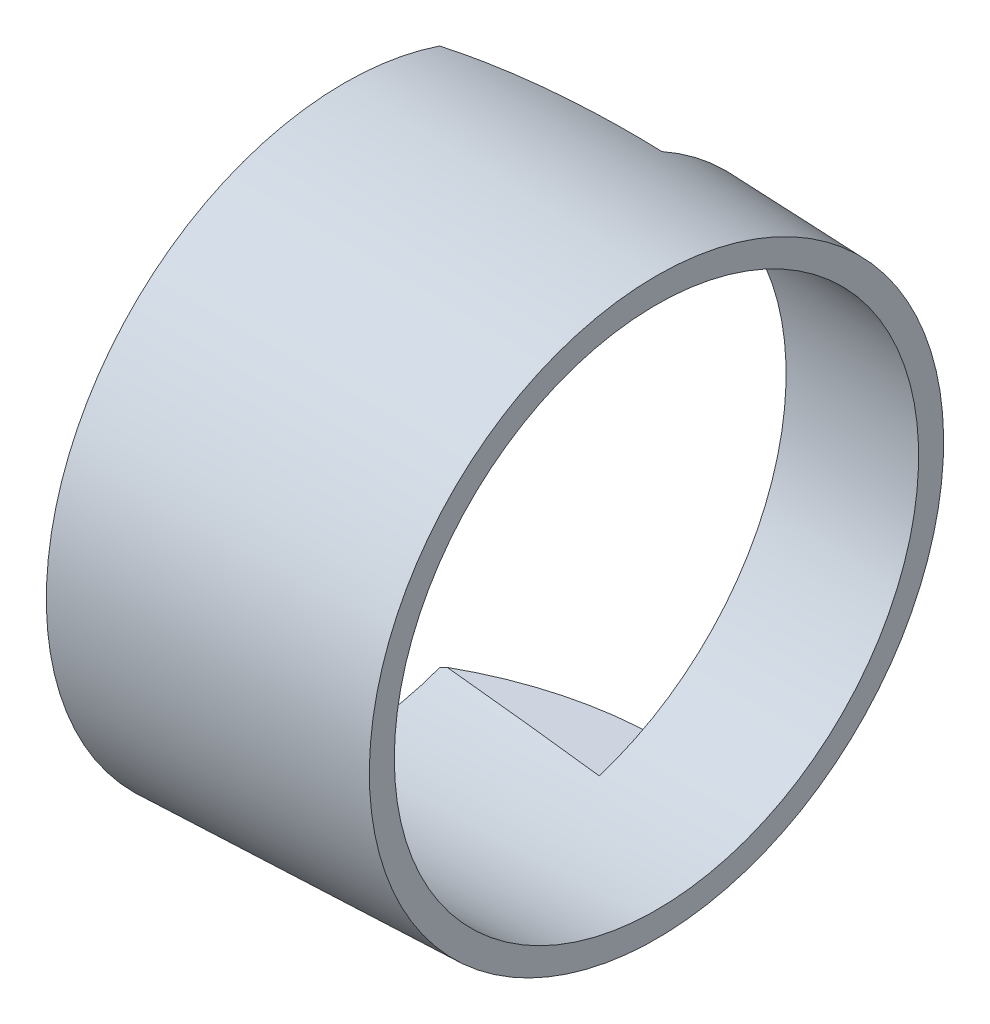
ISO-10303-21;
HEADER;
FILE_DESCRIPTION(('STEP AP214'),'2;1');
FILE_NAME('part.step','',(''),(''),'','','');
FILE_SCHEMA(('AUTOMOTIVE_DESIGN { 1 0 10303 214 1 1 1 1 }'));
ENDSEC;
DATA;
#1=APPLICATION_CONTEXT('core data for automotive mechanical design processes');
#2=APPLICATION_PROTOCOL_DEFINITION('international standard','automotive_design',2000,#1);
#3=PRODUCT_CONTEXT('',#1,'mechanical');
#4=PRODUCT('Part','Part','',(#3));
#5=PRODUCT_RELATED_PRODUCT_CATEGORY('part','',(#4));
#6=PRODUCT_DEFINITION_FORMATION('','',#4);
#7=PRODUCT_DEFINITION_CONTEXT('part definition',#1,'design');
#8=PRODUCT_DEFINITION('design','',#6,#7);
#9=PRODUCT_DEFINITION_SHAPE('','',#8);
#10=(LENGTH_UNIT() NAMED_UNIT(*) SI_UNIT(.MILLI.,.METRE.));
#11=(NAMED_UNIT(*) PLANE_ANGLE_UNIT() SI_UNIT($,.RADIAN.));
#12=(NAMED_UNIT(*) SI_UNIT($,.STERADIAN.) SOLID_ANGLE_UNIT());
#13=UNCERTAINTY_MEASURE_WITH_UNIT(LENGTH_MEASURE(1.E-05),#10,'distance_accuracy_value','');
#14=(GEOMETRIC_REPRESENTATION_CONTEXT(3) GLOBAL_UNCERTAINTY_ASSIGNED_CONTEXT((#13)) GLOBAL_UNIT_ASSIGNED_CONTEXT((#10,
#11,#12)) REPRESENTATION_CONTEXT('',''));
#15=CARTESIAN_POINT('',(0.,0.,0.));
#16=DIRECTION('',(0.,0.,1.));
#17=DIRECTION('',(1.,0.,0.));
#18=AXIS2_PLACEMENT_3D('',#15,#16,#17);
#19=CARTESIAN_POINT('',(-25.,40.65,762.767890449208));
#20=DIRECTION('',(0.,1.,0.));
#21=DIRECTION('',(0.,0.,1.));
#22=AXIS2_PLACEMENT_3D('',#19,#20,#21);
#23=PLANE('',#22);
#24=CARTESIAN_POINT('',(-59.4047124183592,40.65,-0.782885718199415));
#25=CARTESIAN_POINT('',(-57.6717544566597,40.65,-0.653370798799886));
#26=CARTESIAN_POINT('',(-55.9389285981839,40.65,-0.522071836660222));
#27=CARTESIAN_POINT('',(-52.4735860389012,40.65,-0.255413979712227));
#28=CARTESIAN_POINT('',(-50.7410693387126,40.65,-0.120055076874431));
#29=CARTESIAN_POINT('',(-47.2762805738647,40.65,0.155223242577607));
#30=CARTESIAN_POINT('',(-45.5440085334455,40.65,0.295142964826463));
#31=CARTESIAN_POINT('',(-42.0798898436248,40.65,0.58015982339515));
#32=CARTESIAN_POINT('',(-40.3480431942092,40.65,0.725256959544753));
#33=CARTESIAN_POINT('',(-36.8780005518514,40.65,1.02198178604998));
#34=CARTESIAN_POINT('',(-35.1398065715517,40.65,1.17363306052303));
#35=CARTESIAN_POINT('',(-31.664041477714,40.65,1.48390863033523));
#36=CARTESIAN_POINT('',(-29.9264703635171,40.65,1.64253291827625));
#37=CARTESIAN_POINT('',(-26.4521336354311,40.65,1.96801965172869));
#38=CARTESIAN_POINT('',(-24.7153680056737,40.65,2.13488192732839));
#39=CARTESIAN_POINT('',(-21.2428228127734,40.65,2.47853619626773));
#40=CARTESIAN_POINT('',(-19.5070432458318,40.65,2.65532815108969));
#41=CARTESIAN_POINT('',(-16.0386609915337,40.65,3.02096474659446));
#42=CARTESIAN_POINT('',(-14.3060569042739,40.65,3.20979602722264));
#43=CARTESIAN_POINT('',(-10.8426354286919,40.65,3.60304970967851));
#44=CARTESIAN_POINT('',(-9.11181801628107,40.65,3.80747189844636));
#45=CARTESIAN_POINT('',(-5.6553013417985,40.65,4.23665195671833));
#46=CARTESIAN_POINT('',(-3.92959829690848,40.65,4.46137884396294));
#47=CARTESIAN_POINT('',(-1.34404632673419,40.65,4.82054719596039));
#48=CARTESIAN_POINT('',(-0.482666034986479,40.65,4.94395435145949));
#49=CARTESIAN_POINT('',(1.23873137293134,40.65,5.19993602215274));
#50=CARTESIAN_POINT('',(2.09874850419078,40.65,5.33251043513589));
#51=CARTESIAN_POINT('',(3.81810210149362,40.65,5.6095355874917));
#52=CARTESIAN_POINT('',(4.67743596257159,40.65,5.75400256832404));
#53=CARTESIAN_POINT('',(6.39318087877449,40.65,6.05847517921849));
#54=CARTESIAN_POINT('',(7.24959259479038,40.65,6.21847701618393));
#55=CARTESIAN_POINT('',(8.53143188239395,40.65,6.47537608280779));
#56=CARTESIAN_POINT('',(8.95853611997325,40.65,6.56389066037175));
#57=CARTESIAN_POINT('',(9.81119439235369,40.65,6.74794585071401));
#58=CARTESIAN_POINT('',(10.2367485674991,40.65,6.84348580993052));
#59=CARTESIAN_POINT('',(11.0860819121103,40.65,7.04363981274982));
#60=CARTESIAN_POINT('',(11.5098595126879,40.65,7.14826060173352));
#61=CARTESIAN_POINT('',(12.1431993565133,40.65,7.3143481122903));
#62=CARTESIAN_POINT('',(12.3539575551725,40.65,7.37124625526349));
#63=CARTESIAN_POINT('',(12.7744586054105,40.65,7.48874324435476));
#64=CARTESIAN_POINT('',(12.9842013620448,40.65,7.54934242957599));
#65=CARTESIAN_POINT('',(13.1933083356044,40.65,7.61211322867195));
#66=B_SPLINE_CURVE_WITH_KNOTS('',3,(#24,#25,#26,#27,#28,#29,#30,#31,#32,#33,#34,#35,#36,#37,#38,
#39,#40,#41,#42,#43,#44,#45,#46,#47,#48,#49,#50,#51,#52,#53,#54,#55,#56,#57,#58,#59,#60,#61,#62,
#63,#64,#65),.UNSPECIFIED.,.F.,.F.,(4,2,2,2,2,2,2,2,2,2,2,2,2,2,2,2,2,2,2,2,4),(0.,
5.21337376950524,10.4267578503364,15.6404920173271,20.8542260128951,26.0886049205283,
31.3229782747923,36.5572437131295,41.791488848916,47.0200233633911,52.248486439359,
57.4691021315032,60.079592549043,62.6900538654205,65.3041413441511,67.9175921469116,
69.2260862436314,70.5344587665334,71.8438116251954,72.4986922854007,73.1536330384668),.UNSPECIFIED.);
#67=CARTESIAN_POINT('',(-11.,40.65,3.58743809523987));
#68=VERTEX_POINT('',#67);
#69=CARTESIAN_POINT('',(-24.6073645063081,40.65,2.14701644129209));
#70=VERTEX_POINT('',#69);
#71=EDGE_CURVE('E119',#68,#70,#66,.F.);
#72=ORIENTED_EDGE('',*,*,#71,.T.);
#73=CARTESIAN_POINT('',(-10.9124235072327,40.65,26.5693134469351));
#74=DIRECTION('',(0.,1.,0.));
#75=DIRECTION('',(0.,0.,1.));
#76=AXIS2_PLACEMENT_3D('',#73,#74,#75);
#77=CIRCLE('',#76,28.);
#78=CARTESIAN_POINT('',(-11.,40.65,-1.43054959483546));
#79=VERTEX_POINT('',#78);
#80=EDGE_CURVE('E159',#70,#79,#77,.F.);
#81=ORIENTED_EDGE('',*,*,#80,.T.);
#82=DIRECTION('',(0.,0.,-1.));
#83=VECTOR('',#82,1.);
#84=CARTESIAN_POINT('',(-11.,40.65,762.767890449208));
#85=LINE('',#84,#83);
#86=EDGE_CURVE('E85',#79,#68,#85,.F.);
#87=ORIENTED_EDGE('',*,*,#86,.T.);
#88=EDGE_LOOP('',(#72,#81,#87));
#89=FACE_BOUND('',#88,.T.);
#90=ADVANCED_FACE('F17',(#89),#23,.F.);
#91=CARTESIAN_POINT('',(-11.,-0.15,762.767890449208));
#92=DIRECTION('',(0.,-1.,0.));
#93=DIRECTION('',(0.,0.,-1.));
#94=AXIS2_PLACEMENT_3D('',#91,#92,#93);
#95=PLANE('',#94);
#96=DIRECTION('',(0.,0.,-1.));
#97=VECTOR('',#96,1.);
#98=CARTESIAN_POINT('',(-11.,-0.149999999999997,762.767890449208));
#99=LINE('',#98,#97);
#100=CARTESIAN_POINT('',(-11.,-0.149999999999997,-1.43054959483549));
#101=VERTEX_POINT('',#100);
#102=CARTESIAN_POINT('',(-11.,-0.149999999999997,3.58743809523987));
#103=VERTEX_POINT('',#102);
#104=EDGE_CURVE('E82',#101,#103,#99,.F.);
#105=ORIENTED_EDGE('',*,*,#104,.F.);
#106=CARTESIAN_POINT('',(-10.9124235072327,-0.149999999999997,26.5693134469351));
#107=DIRECTION('',(0.,-1.,0.));
#108=DIRECTION('',(0.,0.,-1.));
#109=AXIS2_PLACEMENT_3D('',#106,#107,#108);
#110=CIRCLE('',#109,28.);
#111=CARTESIAN_POINT('',(-24.6073645063096,-0.15,2.14701644127884));
#112=VERTEX_POINT('',#111);
#113=EDGE_CURVE('E11',#101,#112,#110,.F.);
#114=ORIENTED_EDGE('',*,*,#113,.T.);
#115=CARTESIAN_POINT('',(-59.4047124183592,-0.15,-0.782885718199427));
#116=CARTESIAN_POINT('',(-57.6717544566597,-0.15,-0.653370798799888));
#117=CARTESIAN_POINT('',(-55.9389285981839,-0.15,-0.522071836660218));
#118=CARTESIAN_POINT('',(-52.4735860389012,-0.15,-0.255413979712217));
#119=CARTESIAN_POINT('',(-50.7410693387126,-0.15,-0.12005507687442));
#120=CARTESIAN_POINT('',(-47.2762805738647,-0.15,0.155223242577618));
#121=CARTESIAN_POINT('',(-45.5440085334455,-0.15,0.295142964826472));
#122=CARTESIAN_POINT('',(-42.0798898436248,-0.15,0.580159823395159));
#123=CARTESIAN_POINT('',(-40.3480431942092,-0.15,0.725256959544763));
#124=CARTESIAN_POINT('',(-36.8780005518514,-0.15,1.02198178604999));
#125=CARTESIAN_POINT('',(-35.1398065715517,-0.15,1.17363306052303));
#126=CARTESIAN_POINT('',(-31.664041477714,-0.15,1.48390863033524));
#127=CARTESIAN_POINT('',(-29.9264703635171,-0.15,1.64253291827627));
#128=CARTESIAN_POINT('',(-26.4521336354311,-0.15,1.96801965172871));
#129=CARTESIAN_POINT('',(-24.7153680056737,-0.15,2.13488192732841));
#130=CARTESIAN_POINT('',(-21.2428228127734,-0.15,2.47853619626773));
#131=CARTESIAN_POINT('',(-19.5070432458318,-0.15,2.65532815108968));
#132=CARTESIAN_POINT('',(-16.0386609915337,-0.15,3.02096474659446));
#133=CARTESIAN_POINT('',(-14.3060569042739,-0.15,3.20979602722264));
#134=CARTESIAN_POINT('',(-10.8426354286919,-0.15,3.60304970967852));
#135=CARTESIAN_POINT('',(-9.11181801628108,-0.15,3.80747189844637));
#136=CARTESIAN_POINT('',(-5.65530134179851,-0.15,4.23665195671833));
#137=CARTESIAN_POINT('',(-3.92959829690849,-0.15,4.46137884396294));
#138=CARTESIAN_POINT('',(-1.3440463267342,-0.15,4.8205471959604));
#139=CARTESIAN_POINT('',(-0.48266603498649,-0.15,4.94395435145951));
#140=CARTESIAN_POINT('',(1.23873137293133,-0.15,5.19993602215274));
#141=CARTESIAN_POINT('',(2.09874850419077,-0.15,5.33251043513586));
#142=CARTESIAN_POINT('',(3.81810210149362,-0.15,5.60953558749168));
#143=CARTESIAN_POINT('',(4.67743596257158,-0.15,5.75400256832406));
#144=CARTESIAN_POINT('',(6.39318087877448,-0.15,6.05847517921852));
#145=CARTESIAN_POINT('',(7.24959259479038,-0.15,6.21847701618394));
#146=CARTESIAN_POINT('',(8.53143188239395,-0.15,6.4753760828078));
#147=CARTESIAN_POINT('',(8.95853611997325,-0.15,6.56389066037176));
#148=CARTESIAN_POINT('',(9.81119439235369,-0.15,6.74794585071404));
#149=CARTESIAN_POINT('',(10.2367485674991,-0.15,6.84348580993055));
#150=CARTESIAN_POINT('',(11.0860819121103,-0.15,7.04363981274985));
#151=CARTESIAN_POINT('',(11.5098595126879,-0.15,7.14826060173354));
#152=CARTESIAN_POINT('',(12.1431993565133,-0.15,7.31434811229034));
#153=CARTESIAN_POINT('',(12.3539575551725,-0.15,7.37124625526353));
#154=CARTESIAN_POINT('',(12.7744586054105,-0.15,7.48874324435479));
#155=CARTESIAN_POINT('',(12.9842013620448,-0.15,7.549342429576));
#156=CARTESIAN_POINT('',(13.1933083356044,-0.15,7.61211322867192));
#157=B_SPLINE_CURVE_WITH_KNOTS('',3,(#115,#116,#117,#118,#119,#120,#121,#122,#123,#124,#125,
#126,#127,#128,#129,#130,#131,#132,#133,#134,#135,#136,#137,#138,#139,#140,#141,#142,#143,#144,
#145,#146,#147,#148,#149,#150,#151,#152,#153,#154,#155,#156),.UNSPECIFIED.,.F.,.F.,(4,2,2,2,2,2,
2,2,2,2,2,2,2,2,2,2,2,2,2,2,4),(0.,5.21337376950524,10.4267578503365,15.6404920173271,
20.8542260128952,26.0886049205283,31.3229782747923,36.5572437131295,41.791488848916,
47.0200233633911,52.248486439359,57.4691021315032,60.079592549043,62.6900538654205,
65.3041413441511,67.9175921469116,69.2260862436314,70.5344587665334,71.8438116251954,
72.4986922854007,73.1536330384668),.UNSPECIFIED.);
#158=EDGE_CURVE('E89',#112,#103,#157,.T.);
#159=ORIENTED_EDGE('',*,*,#158,.T.);
#160=EDGE_LOOP('',(#105,#114,#159));
#161=FACE_BOUND('',#160,.T.);
#162=ADVANCED_FACE('F88',(#161),#95,.F.);
#163=CARTESIAN_POINT('',(-25.,20.25,10.));
#164=DIRECTION('',(-1.,0.,0.));
#165=DIRECTION('',(0.,0.,1.));
#166=AXIS2_PLACEMENT_3D('',#163,#164,#165);
#167=PLANE('',#166);
#168=DIRECTION('',(0.,-1.,0.));
#169=VECTOR('',#168,1.);
#170=CARTESIAN_POINT('',(-25.,44.95,2.37137575463524));
#171=LINE('',#170,#169);
#172=CARTESIAN_POINT('',(-25.,-2.37134256907021,2.37137575463524));
#173=VERTEX_POINT('',#172);
#174=CARTESIAN_POINT('',(-25.,-0.249586890424232,2.37137575463523));
#175=VERTEX_POINT('',#174);
#176=EDGE_CURVE('E76',#173,#175,#171,.F.);
#177=ORIENTED_EDGE('',*,*,#176,.F.);
#178=CARTESIAN_POINT('',(-25.,20.25,10.));
#179=DIRECTION('',(-1.,0.,0.));
#180=DIRECTION('',(0.,0.,1.));
#181=AXIS2_PLACEMENT_3D('',#178,#179,#180);
#182=CIRCLE('',#181,23.8730192372937);
#183=CARTESIAN_POINT('',(-25.,42.8713425690702,2.37137575463523));
#184=VERTEX_POINT('',#183);
#185=EDGE_CURVE('E29',#173,#184,#182,.T.);
#186=ORIENTED_EDGE('',*,*,#185,.T.);
#187=CARTESIAN_POINT('',(-25.,40.7495868904243,2.37137575463524));
#188=VERTEX_POINT('',#187);
#189=EDGE_CURVE('E165',#188,#184,#171,.F.);
#190=ORIENTED_EDGE('',*,*,#189,.F.);
#191=CARTESIAN_POINT('',(-25.,20.25,10.));
#192=DIRECTION('',(-1.,0.,0.));
#193=DIRECTION('',(0.,0.,1.));
#194=AXIS2_PLACEMENT_3D('',#191,#192,#193);
#195=CIRCLE('',#194,21.8730192372937);
#196=EDGE_CURVE('E22',#175,#188,#195,.T.);
#197=ORIENTED_EDGE('',*,*,#196,.F.);
#198=EDGE_LOOP('',(#177,#186,#190,#197));
#199=FACE_BOUND('',#198,.T.);
#200=ADVANCED_FACE('F143',(#199),#167,.T.);
#201=CARTESIAN_POINT('',(0.,20.25,10.));
#202=DIRECTION('',(-1.,0.,0.));
#203=DIRECTION('',(0.,1.,0.));
#204=AXIS2_PLACEMENT_3D('',#201,#202,#203);
#205=CONICAL_SURFACE('',#204,23.,0.0349065850398866);
#206=CARTESIAN_POINT('',(-11.,20.25,10.));
#207=DIRECTION('',(1.,0.,0.));
#208=DIRECTION('',(0.,1.,0.));
#209=AXIS2_PLACEMENT_3D('',#206,#207,#208);
#210=CIRCLE('',#209,23.3841284644092);
#211=EDGE_CURVE('E43',#101,#79,#210,.T.);
#212=ORIENTED_EDGE('',*,*,#211,.T.);
#213=CARTESIAN_POINT('',(-10.9998,40.6499916440896,-1.43055021967063));
#214=CARTESIAN_POINT('',(-11.3777903219234,40.6657556102012,-1.42937929602379));
#215=CARTESIAN_POINT('',(-11.7555634748983,40.6858481982956,-1.42053780484608));
#216=CARTESIAN_POINT('',(-12.5098799230286,40.7343608376016,-1.3876268921835));
#217=CARTESIAN_POINT('',(-12.8864233175017,40.7627801986232,-1.3635587326161));
#218=CARTESIAN_POINT('',(-13.637282293575,40.8275964199456,-1.30032980002926));
#219=CARTESIAN_POINT('',(-14.0115992611662,40.8639876300045,-1.26117970186694));
#220=CARTESIAN_POINT('',(-14.7575413566438,40.9442425702148,-1.16796091701741));
#221=CARTESIAN_POINT('',(-15.1291664577376,40.9881063746356,-1.11389208205127));
#222=CARTESIAN_POINT('',(-16.2232304874419,41.1279944085273,-0.932210722920244));
#223=CARTESIAN_POINT('',(-16.9410747578564,41.2337660999262,-0.783733368962049));
#224=CARTESIAN_POINT('',(-18.3596429655041,41.4660152336035,-0.43204074222878));
#225=CARTESIAN_POINT('',(-19.0603676368069,41.5924917862831,-0.228827820963603));
#226=CARTESIAN_POINT('',(-20.2051245259928,41.8138904055759,0.151989317615817));
#227=CARTESIAN_POINT('',(-20.6549948300062,41.9048130822942,0.314587612332254));
#228=CARTESIAN_POINT('',(-21.5449966622495,42.0907829727899,0.662238243445184));
#229=CARTESIAN_POINT('',(-21.9851304422976,42.1858292175064,0.847285322420074));
#230=CARTESIAN_POINT('',(-22.8612672322624,42.3794277742434,1.24226465757798));
#231=CARTESIAN_POINT('',(-23.2971185783274,42.4780109063384,1.45251795112479));
#232=CARTESIAN_POINT('',(-24.1574219521585,42.6752156894739,1.89535869476999));
#233=CARTESIAN_POINT('',(-24.5818718346941,42.7738373442698,2.12795031076301));
#234=CARTESIAN_POINT('',(-25.0002,42.8713892056154,2.3714921919165));
#235=B_SPLINE_CURVE_WITH_KNOTS('',3,(#213,#214,#215,#216,#217,#218,#219,#220,#221,#222,#223,
#224,#225,#226,#227,#228,#229,#230,#231,#232,#233,#234),.UNSPECIFIED.,.F.,.F.,(4,2,2,2,2,2,2,2,
2,2,4),(0.,1.13483974538849,2.26958545270435,3.40352946875794,4.53748475560877,6.75654406257534,
8.97550805112069,10.4356743614244,11.8954993640007,13.3764251777912,14.8576277090923),.UNSPECIFIED.);
#236=EDGE_CURVE('E158',#79,#184,#235,.T.);
#237=ORIENTED_EDGE('',*,*,#236,.T.);
#238=ORIENTED_EDGE('',*,*,#185,.F.);
#239=CARTESIAN_POINT('',(-25.0002,-2.37138920561541,2.3714921919165));
#240=CARTESIAN_POINT('',(-24.6647109953515,-2.29315851239617,2.17617991540671));
#241=CARTESIAN_POINT('',(-24.3253286616815,-2.21424533559047,1.98793012600836));
#242=CARTESIAN_POINT('',(-23.6390694207743,-2.05615299174016,1.62571448647631));
#243=CARTESIAN_POINT('',(-23.2921922430165,-1.97697381518192,1.45174915302038));
#244=CARTESIAN_POINT('',(-22.2402906192204,-1.74058149371402,0.951299513318229));
#245=CARTESIAN_POINT('',(-21.5244782897363,-1.58462896080876,0.646542281576252));
#246=CARTESIAN_POINT('',(-20.0849563369391,-1.28848635187111,0.103436804628962));
#247=CARTESIAN_POINT('',(-19.3618288521471,-1.14801173047385,-0.136305309235429));
#248=CARTESIAN_POINT('',(-17.8954347959788,-0.8865702062221,-0.556661843457713));
#249=CARTESIAN_POINT('',(-17.1521810862344,-0.76559117305378,-0.737313103255701));
#250=CARTESIAN_POINT('',(-15.9620266154089,-0.59482936035975,-0.975234794646943));
#251=CARTESIAN_POINT('',(-15.5202854533872,-0.536348447212503,-1.05258405036334));
#252=CARTESIAN_POINT('',(-14.6324326366786,-0.429560596009462,-1.18609996350002));
#253=CARTESIAN_POINT('',(-14.1863217378384,-0.381251929850625,-1.24227022017954));
#254=CARTESIAN_POINT('',(-13.2846400307558,-0.295198071952171,-1.33374571294242));
#255=CARTESIAN_POINT('',(-12.8290238273245,-0.257608657714125,-1.36875080440467));
#256=CARTESIAN_POINT('',(-11.9156481652419,-0.194542993567406,-1.41645105382223));
#257=CARTESIAN_POINT('',(-11.4578880744596,-0.1690705775166,-1.42913915402936));
#258=CARTESIAN_POINT('',(-10.9998,-0.149991644089624,-1.43055021967063));
#259=B_SPLINE_CURVE_WITH_KNOTS('',3,(#239,#240,#241,#242,#243,#244,#245,#246,#247,#248,#249,
#250,#251,#252,#253,#254,#255,#256,#257,#258),.UNSPECIFIED.,.F.,.F.,(4,2,2,2,2,2,2,2,2,4),(0.,
1.18783280247994,2.37570855071193,4.75316428400524,7.0746786040257,9.39474283468931,
10.7509738995659,12.1069743761275,13.4817790068613,14.85701834142),.UNSPECIFIED.);
#260=EDGE_CURVE('E67',#173,#101,#259,.T.);
#261=ORIENTED_EDGE('',*,*,#260,.T.);
#262=EDGE_LOOP('',(#212,#237,#238,#261));
#263=FACE_BOUND('',#262,.T.);
#264=CARTESIAN_POINT('',(0.,20.25,10.));
#265=DIRECTION('',(-1.,0.,0.));
#266=DIRECTION('',(0.,1.,0.));
#267=AXIS2_PLACEMENT_3D('',#264,#265,#266);
#268=CIRCLE('',#267,23.);
#269=CARTESIAN_POINT('',(0.,43.25,10.));
#270=VERTEX_POINT('',#269);
#271=EDGE_CURVE('E105',#270,#270,#268,.T.);
#272=ORIENTED_EDGE('',*,*,#271,.T.);
#273=EDGE_LOOP('',(#272));
#274=FACE_BOUND('',#273,.T.);
#275=ADVANCED_FACE('F19',(#263,#274),#205,.T.);
#276=CARTESIAN_POINT('',(0.,20.25,10.));
#277=DIRECTION('',(-1.,0.,0.));
#278=DIRECTION('',(0.,0.,1.));
#279=AXIS2_PLACEMENT_3D('',#276,#277,#278);
#280=PLANE('',#279);
#281=CARTESIAN_POINT('',(0.,20.25,10.));
#282=DIRECTION('',(-1.,0.,0.));
#283=DIRECTION('',(0.,0.,1.));
#284=AXIS2_PLACEMENT_3D('',#281,#282,#283);
#285=CIRCLE('',#284,21.);
#286=CARTESIAN_POINT('',(0.,20.25,31.));
#287=VERTEX_POINT('',#286);
#288=EDGE_CURVE('E101',#287,#287,#285,.T.);
#289=ORIENTED_EDGE('',*,*,#288,.T.);
#290=EDGE_LOOP('',(#289));
#291=FACE_BOUND('',#290,.T.);
#292=ORIENTED_EDGE('',*,*,#271,.F.);
#293=EDGE_LOOP('',(#292));
#294=FACE_BOUND('',#293,.T.);
#295=ADVANCED_FACE('F141',(#291,#294),#280,.F.);
#296=CARTESIAN_POINT('',(-25.,20.25,10.));
#297=DIRECTION('',(-1.,0.,0.));
#298=DIRECTION('',(0.,0.,1.));
#299=AXIS2_PLACEMENT_3D('',#296,#297,#298);
#300=CONICAL_SURFACE('',#299,21.8730192372937,0.0349065850398866);
#301=ORIENTED_EDGE('',*,*,#288,.F.);
#302=EDGE_LOOP('',(#301));
#303=FACE_BOUND('',#302,.T.);
#304=ORIENTED_EDGE('',*,*,#158,.F.);
#305=CARTESIAN_POINT('',(-10.9998,2.1772809694306,-1.43055021967063));
#306=CARTESIAN_POINT('',(-11.3694141439044,2.16130970542228,-1.42940580586015));
#307=CARTESIAN_POINT('',(-11.7387889744409,2.14066723994154,-1.42092565315051));
#308=CARTESIAN_POINT('',(-12.4762689930044,2.09041279823861,-1.38941430340488));
#309=CARTESIAN_POINT('',(-12.8443743089,2.06080175372241,-1.36638461758576));
#310=CARTESIAN_POINT('',(-13.5782652506201,1.99301062254753,-1.30592203903383));
#311=CARTESIAN_POINT('',(-13.9440526916903,1.95483840615434,-1.26850235255855));
#312=CARTESIAN_POINT('',(-14.6729413443411,1.87048338158012,-1.17944052396531));
#313=CARTESIAN_POINT('',(-15.0360425135986,1.82430044746624,-1.12779815825157));
#314=CARTESIAN_POINT('',(-16.1051275418393,1.67682544010981,-0.954303489174222));
#315=CARTESIAN_POINT('',(-16.8065565175056,1.5651044866609,-0.81256890596778));
#316=CARTESIAN_POINT('',(-18.1927904463786,1.31958479981774,-0.477037233276156));
#317=CARTESIAN_POINT('',(-18.8775946221629,1.18578503622866,-0.283237714181687));
#318=CARTESIAN_POINT('',(-20.0246040626945,0.945578607110686,0.0888586036445046));
#319=CARTESIAN_POINT('',(-20.4918430053321,0.843027884134806,0.254303510590612));
#320=CARTESIAN_POINT('',(-21.4158368863437,0.63301746260929,0.609283224005102));
#321=CARTESIAN_POINT('',(-21.872594193107,0.52555888975906,0.79881252390489));
#322=CARTESIAN_POINT('',(-22.7818211248966,0.306557227408875,1.20459295541318));
#323=CARTESIAN_POINT('',(-23.2341197571915,0.194976867433241,1.42120680518303));
#324=CARTESIAN_POINT('',(-24.1265340155725,-0.0280782521468119,1.87845367518043));
#325=CARTESIAN_POINT('',(-24.5666476241509,-0.139552991347143,2.11909064296033));
#326=CARTESIAN_POINT('',(-25.00025,-0.249650368097031,2.37152130158266));
#327=B_SPLINE_CURVE_WITH_KNOTS('',3,(#305,#306,#307,#308,#309,#310,#311,#312,#313,#314,#315,
#316,#317,#318,#319,#320,#321,#322,#323,#324,#325,#326),.UNSPECIFIED.,.F.,.F.,(4,2,2,2,2,2,2,2,
2,2,4),(0.,1.10975773354952,2.21940021879891,3.32802676340185,4.43667073779881,6.60675209616205,
8.77693473892781,10.2947558554521,11.8122305651289,13.352795159493,14.8936133221463),.UNSPECIFIED.);
#328=EDGE_CURVE('E36',#112,#175,#327,.T.);
#329=ORIENTED_EDGE('',*,*,#328,.T.);
#330=ORIENTED_EDGE('',*,*,#196,.T.);
#331=CARTESIAN_POINT('',(-25.00025,40.7496503680971,2.37152130158266));
#332=CARTESIAN_POINT('',(-24.6146508047753,40.651742687445,2.14703856242025));
#333=CARTESIAN_POINT('',(-24.223960723956,40.5527590177118,1.93191078652233));
#334=CARTESIAN_POINT('',(-23.4327883542851,40.3544552676426,1.52057280973963));
#335=CARTESIAN_POINT('',(-23.0323053082906,40.2551351618098,1.32436407741442));
#336=CARTESIAN_POINT('',(-21.8154739358592,39.95908433509,0.763847818049197));
#337=CARTESIAN_POINT('',(-20.9850484070629,39.7646060845991,0.428409978422537));
#338=CARTESIAN_POINT('',(-19.3154126018918,39.4017466337128,-0.154254550851546));
#339=CARTESIAN_POINT('',(-18.4771057077263,39.2327854444054,-0.403696132175589));
#340=CARTESIAN_POINT('',(-17.2013935171533,39.0040294337633,-0.718790192332414));
#341=CARTESIAN_POINT('',(-16.7733078044769,38.9319182102738,-0.813947735573433));
#342=CARTESIAN_POINT('',(-15.9117089056108,38.7973304623935,-0.98426832881697));
#343=CARTESIAN_POINT('',(-15.4781967853777,38.7348520768829,-1.05943524316394));
#344=CARTESIAN_POINT('',(-14.7111687996987,38.6345087400677,-1.17382564748646));
#345=CARTESIAN_POINT('',(-14.3785867831289,38.5943334668268,-1.21734598334317));
#346=CARTESIAN_POINT('',(-13.7113722875817,38.5208035437628,-1.29246259880043));
#347=CARTESIAN_POINT('',(-13.376740144722,38.4874478051532,-1.32406078253814));
#348=CARTESIAN_POINT('',(-12.7023074299887,38.4276414494602,-1.37548734847588));
#349=CARTESIAN_POINT('',(-12.3624899737392,38.4012689370689,-1.39518552113915));
#350=CARTESIAN_POINT('',(-11.6817818424169,38.3561790476422,-1.42218952938117));
#351=CARTESIAN_POINT('',(-11.3408909463076,38.3374633674355,-1.42949261921658));
#352=CARTESIAN_POINT('',(-10.9998,38.3227190305694,-1.43055021967063));
#353=B_SPLINE_CURVE_WITH_KNOTS('',3,(#331,#332,#333,#334,#335,#336,#337,#338,#339,#340,#341,
#342,#343,#344,#345,#346,#347,#348,#349,#350,#351,#352),.UNSPECIFIED.,.F.,.F.,(4,2,2,2,2,2,2,2,
2,2,4),(0.,1.37013532224749,2.74037691351541,5.48548732942784,8.15341963428513,9.48620557326535,
10.818733686755,11.8319161202196,12.8449366654791,13.8688498347462,14.8929897903973),.UNSPECIFIED.);
#354=EDGE_CURVE('E150',#188,#70,#353,.T.);
#355=ORIENTED_EDGE('',*,*,#354,.T.);
#356=ORIENTED_EDGE('',*,*,#71,.F.);
#357=CARTESIAN_POINT('',(-11.,20.25,10.));
#358=DIRECTION('',(1.,0.,0.));
#359=DIRECTION('',(0.,1.,0.));
#360=AXIS2_PLACEMENT_3D('',#357,#358,#359);
#361=CIRCLE('',#360,21.3841284644092);
#362=EDGE_CURVE('E91',#103,#68,#361,.T.);
#363=ORIENTED_EDGE('',*,*,#362,.F.);
#364=EDGE_LOOP('',(#304,#329,#330,#355,#356,#363));
#365=FACE_BOUND('',#364,.T.);
#366=ADVANCED_FACE('F137',(#303,#365),#300,.F.);
#367=CARTESIAN_POINT('',(-11.,40.65,762.767890449208));
#368=DIRECTION('',(1.,0.,0.));
#369=DIRECTION('',(0.,1.,0.));
#370=AXIS2_PLACEMENT_3D('',#367,#368,#369);
#371=PLANE('',#370);
#372=ORIENTED_EDGE('',*,*,#362,.T.);
#373=ORIENTED_EDGE('',*,*,#86,.F.);
#374=ORIENTED_EDGE('',*,*,#211,.F.);
#375=ORIENTED_EDGE('',*,*,#104,.T.);
#376=EDGE_LOOP('',(#372,#373,#374,#375));
#377=FACE_BOUND('',#376,.T.);
#378=ADVANCED_FACE('F81',(#377),#371,.F.);
#379=CARTESIAN_POINT('',(-10.9124235072327,44.95,26.5693134469351));
#380=DIRECTION('',(0.,-1.,0.));
#381=DIRECTION('',(0.,0.,-1.));
#382=AXIS2_PLACEMENT_3D('',#379,#380,#381);
#383=CYLINDRICAL_SURFACE('',#382,28.);
#384=ORIENTED_EDGE('',*,*,#176,.T.);
#385=ORIENTED_EDGE('',*,*,#328,.F.);
#386=ORIENTED_EDGE('',*,*,#113,.F.);
#387=ORIENTED_EDGE('',*,*,#260,.F.);
#388=EDGE_LOOP('',(#384,#385,#386,#387));
#389=FACE_BOUND('',#388,.T.);
#390=ADVANCED_FACE('F66',(#389),#383,.T.);
#391=ORIENTED_EDGE('',*,*,#189,.T.);
#392=ORIENTED_EDGE('',*,*,#236,.F.);
#393=ORIENTED_EDGE('',*,*,#80,.F.);
#394=ORIENTED_EDGE('',*,*,#354,.F.);
#395=EDGE_LOOP('',(#391,#392,#393,#394));
#396=FACE_BOUND('',#395,.T.);
#397=ADVANCED_FACE('F179',(#396),#383,.T.);
#398=CLOSED_SHELL('',(#90,#162,#200,#275,#295,#366,#378,#390,#397));
#399=MANIFOLD_SOLID_BREP('B1',#398);
#400=ADVANCED_BREP_SHAPE_REPRESENTATION('',(#18,#399),#14);
#401=SHAPE_DEFINITION_REPRESENTATION(#9,#400);
ENDSEC;
END-ISO-10303-21;
